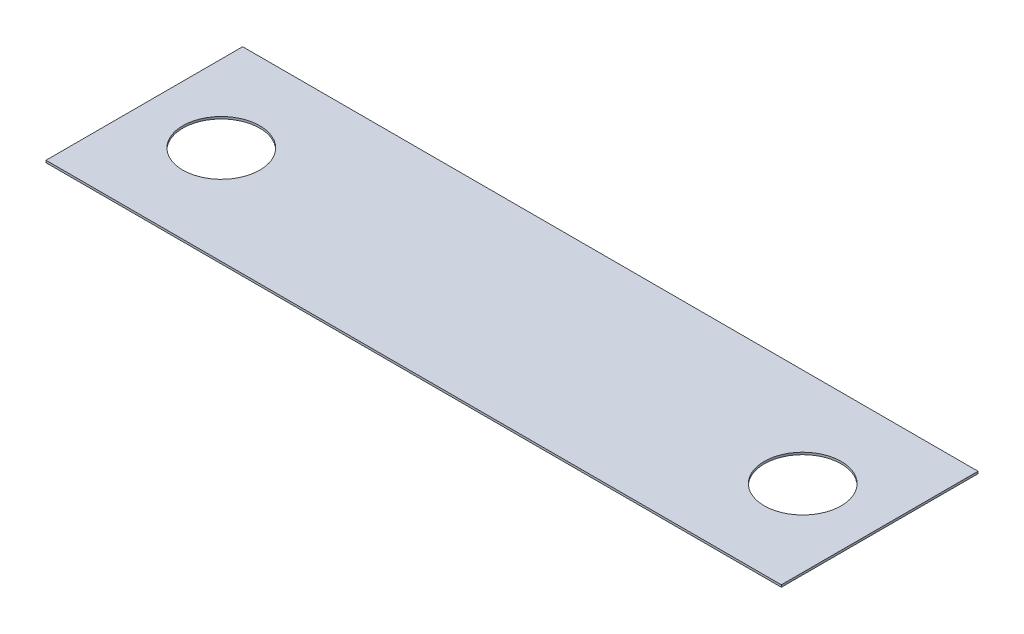
ISO-10303-21;
HEADER;
FILE_DESCRIPTION(('STEP AP214'),'2;1');
FILE_NAME('part.step','',(''),(''),'','','');
FILE_SCHEMA(('AUTOMOTIVE_DESIGN { 1 0 10303 214 1 1 1 1 }'));
ENDSEC;
DATA;
#1=APPLICATION_CONTEXT('core data for automotive mechanical design processes');
#2=APPLICATION_PROTOCOL_DEFINITION('international standard','automotive_design',2000,#1);
#3=PRODUCT_CONTEXT('',#1,'mechanical');
#4=PRODUCT('Part','Part','',(#3));
#5=PRODUCT_RELATED_PRODUCT_CATEGORY('part','',(#4));
#6=PRODUCT_DEFINITION_FORMATION('','',#4);
#7=PRODUCT_DEFINITION_CONTEXT('part definition',#1,'design');
#8=PRODUCT_DEFINITION('design','',#6,#7);
#9=PRODUCT_DEFINITION_SHAPE('','',#8);
#10=(LENGTH_UNIT() NAMED_UNIT(*) SI_UNIT(.MILLI.,.METRE.));
#11=(NAMED_UNIT(*) PLANE_ANGLE_UNIT() SI_UNIT($,.RADIAN.));
#12=(NAMED_UNIT(*) SI_UNIT($,.STERADIAN.) SOLID_ANGLE_UNIT());
#13=UNCERTAINTY_MEASURE_WITH_UNIT(LENGTH_MEASURE(1.E-05),#10,'distance_accuracy_value','');
#14=(GEOMETRIC_REPRESENTATION_CONTEXT(3) GLOBAL_UNCERTAINTY_ASSIGNED_CONTEXT((#13)) GLOBAL_UNIT_ASSIGNED_CONTEXT((#10,
#11,#12)) REPRESENTATION_CONTEXT('',''));
#15=CARTESIAN_POINT('',(0.,0.,0.));
#16=DIRECTION('',(0.,0.,1.));
#17=DIRECTION('',(1.,0.,0.));
#18=AXIS2_PLACEMENT_3D('',#15,#16,#17);
#19=CARTESIAN_POINT('',(0.,0.254,0.));
#20=DIRECTION('',(1.,0.,0.));
#21=DIRECTION('',(0.,0.,-1.));
#22=AXIS2_PLACEMENT_3D('',#19,#20,#21);
#23=PLANE('',#22);
#24=DIRECTION('',(0.,0.,1.));
#25=VECTOR('',#24,1.);
#26=CARTESIAN_POINT('',(0.,0.,0.));
#27=LINE('',#26,#25);
#28=CARTESIAN_POINT('',(0.,0.,-23.));
#29=VERTEX_POINT('',#28);
#30=CARTESIAN_POINT('',(0.,0.,0.));
#31=VERTEX_POINT('',#30);
#32=EDGE_CURVE('E97',#29,#31,#27,.T.);
#33=ORIENTED_EDGE('',*,*,#32,.T.);
#34=DIRECTION('',(0.,-1.,0.));
#35=VECTOR('',#34,1.);
#36=CARTESIAN_POINT('',(0.,0.254,0.));
#37=LINE('',#36,#35);
#38=CARTESIAN_POINT('',(0.,0.254,0.));
#39=VERTEX_POINT('',#38);
#40=EDGE_CURVE('E11',#39,#31,#37,.T.);
#41=ORIENTED_EDGE('',*,*,#40,.F.);
#42=DIRECTION('',(0.,0.,1.));
#43=VECTOR('',#42,1.);
#44=CARTESIAN_POINT('',(0.,0.254,0.));
#45=LINE('',#44,#43);
#46=CARTESIAN_POINT('',(0.,0.254,-23.));
#47=VERTEX_POINT('',#46);
#48=EDGE_CURVE('E85',#47,#39,#45,.T.);
#49=ORIENTED_EDGE('',*,*,#48,.F.);
#50=DIRECTION('',(0.,-1.,0.));
#51=VECTOR('',#50,1.);
#52=CARTESIAN_POINT('',(0.,0.254,-23.));
#53=LINE('',#52,#51);
#54=EDGE_CURVE('E93',#47,#29,#53,.T.);
#55=ORIENTED_EDGE('',*,*,#54,.T.);
#56=EDGE_LOOP('',(#33,#41,#49,#55));
#57=FACE_BOUND('',#56,.T.);
#58=ADVANCED_FACE('F34',(#57),#23,.F.);
#59=CARTESIAN_POINT('',(0.,0.254,0.));
#60=DIRECTION('',(0.,0.,-1.));
#61=DIRECTION('',(-1.,0.,0.));
#62=AXIS2_PLACEMENT_3D('',#59,#60,#61);
#63=PLANE('',#62);
#64=DIRECTION('',(1.,0.,0.));
#65=VECTOR('',#64,1.);
#66=CARTESIAN_POINT('',(0.,0.,0.));
#67=LINE('',#66,#65);
#68=CARTESIAN_POINT('',(86.,0.,0.));
#69=VERTEX_POINT('',#68);
#70=EDGE_CURVE('E89',#31,#69,#67,.T.);
#71=ORIENTED_EDGE('',*,*,#70,.T.);
#72=DIRECTION('',(0.,-1.,0.));
#73=VECTOR('',#72,1.);
#74=CARTESIAN_POINT('',(86.,0.254,0.));
#75=LINE('',#74,#73);
#76=CARTESIAN_POINT('',(86.,0.254,0.));
#77=VERTEX_POINT('',#76);
#78=EDGE_CURVE('E42',#77,#69,#75,.T.);
#79=ORIENTED_EDGE('',*,*,#78,.F.);
#80=DIRECTION('',(1.,0.,0.));
#81=VECTOR('',#80,1.);
#82=CARTESIAN_POINT('',(0.,0.254,0.));
#83=LINE('',#82,#81);
#84=EDGE_CURVE('E80',#39,#77,#83,.T.);
#85=ORIENTED_EDGE('',*,*,#84,.F.);
#86=ORIENTED_EDGE('',*,*,#40,.T.);
#87=EDGE_LOOP('',(#71,#79,#85,#86));
#88=FACE_BOUND('',#87,.T.);
#89=ADVANCED_FACE('F88',(#88),#63,.F.);
#90=CARTESIAN_POINT('',(86.,0.254,0.));
#91=DIRECTION('',(-1.,0.,0.));
#92=DIRECTION('',(0.,0.,1.));
#93=AXIS2_PLACEMENT_3D('',#90,#91,#92);
#94=PLANE('',#93);
#95=DIRECTION('',(0.,0.,-1.));
#96=VECTOR('',#95,1.);
#97=CARTESIAN_POINT('',(86.,0.,0.));
#98=LINE('',#97,#96);
#99=CARTESIAN_POINT('',(86.,0.,-23.));
#100=VERTEX_POINT('',#99);
#101=EDGE_CURVE('E67',#69,#100,#98,.T.);
#102=ORIENTED_EDGE('',*,*,#101,.T.);
#103=DIRECTION('',(0.,-1.,0.));
#104=VECTOR('',#103,1.);
#105=CARTESIAN_POINT('',(86.,0.254,-23.));
#106=LINE('',#105,#104);
#107=CARTESIAN_POINT('',(86.,0.254,-23.));
#108=VERTEX_POINT('',#107);
#109=EDGE_CURVE('E90',#108,#100,#106,.T.);
#110=ORIENTED_EDGE('',*,*,#109,.F.);
#111=DIRECTION('',(0.,0.,-1.));
#112=VECTOR('',#111,1.);
#113=CARTESIAN_POINT('',(86.,0.254,0.));
#114=LINE('',#113,#112);
#115=EDGE_CURVE('E83',#77,#108,#114,.T.);
#116=ORIENTED_EDGE('',*,*,#115,.F.);
#117=ORIENTED_EDGE('',*,*,#78,.T.);
#118=EDGE_LOOP('',(#102,#110,#116,#117));
#119=FACE_BOUND('',#118,.T.);
#120=ADVANCED_FACE('F91',(#119),#94,.F.);
#121=CARTESIAN_POINT('',(0.,0.254,-23.));
#122=DIRECTION('',(0.,0.,1.));
#123=DIRECTION('',(1.,0.,0.));
#124=AXIS2_PLACEMENT_3D('',#121,#122,#123);
#125=PLANE('',#124);
#126=DIRECTION('',(-1.,0.,0.));
#127=VECTOR('',#126,1.);
#128=CARTESIAN_POINT('',(0.,0.,-23.));
#129=LINE('',#128,#127);
#130=EDGE_CURVE('E73',#100,#29,#129,.T.);
#131=ORIENTED_EDGE('',*,*,#130,.T.);
#132=ORIENTED_EDGE('',*,*,#54,.F.);
#133=DIRECTION('',(-1.,0.,0.));
#134=VECTOR('',#133,1.);
#135=CARTESIAN_POINT('',(0.,0.254,-23.));
#136=LINE('',#135,#134);
#137=EDGE_CURVE('E50',#108,#47,#136,.T.);
#138=ORIENTED_EDGE('',*,*,#137,.F.);
#139=ORIENTED_EDGE('',*,*,#109,.T.);
#140=EDGE_LOOP('',(#131,#132,#138,#139));
#141=FACE_BOUND('',#140,.T.);
#142=ADVANCED_FACE('F105',(#141),#125,.F.);
#143=CARTESIAN_POINT('',(0.,0.254,-23.));
#144=DIRECTION('',(0.,-1.,0.));
#145=DIRECTION('',(0.,0.,-1.));
#146=AXIS2_PLACEMENT_3D('',#143,#144,#145);
#147=PLANE('',#146);
#148=CARTESIAN_POINT('',(8.99999999999999,0.254000000000001,-11.5));
#149=DIRECTION('',(0.,1.,0.));
#150=DIRECTION('',(0.,0.,1.));
#151=AXIS2_PLACEMENT_3D('',#148,#149,#150);
#152=CIRCLE('',#151,4.49999999999999);
#153=CARTESIAN_POINT('',(8.99999999999999,0.254000000000001,-7.));
#154=VERTEX_POINT('',#153);
#155=EDGE_CURVE('E119',#154,#154,#152,.T.);
#156=ORIENTED_EDGE('',*,*,#155,.F.);
#157=EDGE_LOOP('',(#156));
#158=FACE_BOUND('',#157,.T.);
#159=CARTESIAN_POINT('',(77.,0.254000000000001,-11.5));
#160=DIRECTION('',(0.,1.,0.));
#161=DIRECTION('',(0.,0.,1.));
#162=AXIS2_PLACEMENT_3D('',#159,#160,#161);
#163=CIRCLE('',#162,4.49999999999999);
#164=CARTESIAN_POINT('',(77.,0.254000000000001,-7.00000000000001));
#165=VERTEX_POINT('',#164);
#166=EDGE_CURVE('E113',#165,#165,#163,.T.);
#167=ORIENTED_EDGE('',*,*,#166,.F.);
#168=EDGE_LOOP('',(#167));
#169=FACE_BOUND('',#168,.T.);
#170=ORIENTED_EDGE('',*,*,#48,.T.);
#171=ORIENTED_EDGE('',*,*,#84,.T.);
#172=ORIENTED_EDGE('',*,*,#115,.T.);
#173=ORIENTED_EDGE('',*,*,#137,.T.);
#174=EDGE_LOOP('',(#170,#171,#172,#173));
#175=FACE_BOUND('',#174,.T.);
#176=ADVANCED_FACE('F81',(#158,#169,#175),#147,.F.);
#177=CARTESIAN_POINT('',(0.,0.,-23.));
#178=DIRECTION('',(0.,-1.,0.));
#179=DIRECTION('',(0.,0.,-1.));
#180=AXIS2_PLACEMENT_3D('',#177,#178,#179);
#181=PLANE('',#180);
#182=CARTESIAN_POINT('',(8.99999999999999,0.,-11.5));
#183=DIRECTION('',(0.,1.,0.));
#184=DIRECTION('',(0.,0.,1.));
#185=AXIS2_PLACEMENT_3D('',#182,#183,#184);
#186=CIRCLE('',#185,4.5);
#187=CARTESIAN_POINT('',(8.99999999999999,0.,-6.99999999999999));
#188=VERTEX_POINT('',#187);
#189=EDGE_CURVE('E116',#188,#188,#186,.T.);
#190=ORIENTED_EDGE('',*,*,#189,.T.);
#191=EDGE_LOOP('',(#190));
#192=FACE_BOUND('',#191,.T.);
#193=CARTESIAN_POINT('',(77.,0.,-11.5));
#194=DIRECTION('',(0.,1.,0.));
#195=DIRECTION('',(0.,0.,1.));
#196=AXIS2_PLACEMENT_3D('',#193,#194,#195);
#197=CIRCLE('',#196,4.5);
#198=CARTESIAN_POINT('',(77.,0.,-7.));
#199=VERTEX_POINT('',#198);
#200=EDGE_CURVE('E100',#199,#199,#197,.T.);
#201=ORIENTED_EDGE('',*,*,#200,.T.);
#202=EDGE_LOOP('',(#201));
#203=FACE_BOUND('',#202,.T.);
#204=ORIENTED_EDGE('',*,*,#32,.F.);
#205=ORIENTED_EDGE('',*,*,#130,.F.);
#206=ORIENTED_EDGE('',*,*,#101,.F.);
#207=ORIENTED_EDGE('',*,*,#70,.F.);
#208=EDGE_LOOP('',(#204,#205,#206,#207));
#209=FACE_BOUND('',#208,.T.);
#210=ADVANCED_FACE('F108',(#192,#203,#209),#181,.T.);
#211=CARTESIAN_POINT('',(77.,0.254,-11.5));
#212=DIRECTION('',(0.,1.,0.));
#213=DIRECTION('',(0.,0.,1.));
#214=AXIS2_PLACEMENT_3D('',#211,#212,#213);
#215=CYLINDRICAL_SURFACE('',#214,4.5);
#216=ORIENTED_EDGE('',*,*,#200,.F.);
#217=EDGE_LOOP('',(#216));
#218=FACE_BOUND('',#217,.T.);
#219=ORIENTED_EDGE('',*,*,#166,.T.);
#220=EDGE_LOOP('',(#219));
#221=FACE_BOUND('',#220,.T.);
#222=ADVANCED_FACE('F130',(#218,#221),#215,.F.);
#223=CARTESIAN_POINT('',(8.99999999999999,0.254,-11.5));
#224=DIRECTION('',(0.,1.,0.));
#225=DIRECTION('',(0.,0.,1.));
#226=AXIS2_PLACEMENT_3D('',#223,#224,#225);
#227=CYLINDRICAL_SURFACE('',#226,4.49999999999999);
#228=ORIENTED_EDGE('',*,*,#189,.F.);
#229=EDGE_LOOP('',(#228));
#230=FACE_BOUND('',#229,.T.);
#231=ORIENTED_EDGE('',*,*,#155,.T.);
#232=EDGE_LOOP('',(#231));
#233=FACE_BOUND('',#232,.T.);
#234=ADVANCED_FACE('F123',(#230,#233),#227,.F.);
#235=CLOSED_SHELL('',(#58,#89,#120,#142,#176,#210,#222,#234));
#236=MANIFOLD_SOLID_BREP('B2',#235);
#237=ADVANCED_BREP_SHAPE_REPRESENTATION('',(#18,#236),#14);
#238=SHAPE_DEFINITION_REPRESENTATION(#9,#237);
ENDSEC;
END-ISO-10303-21;
